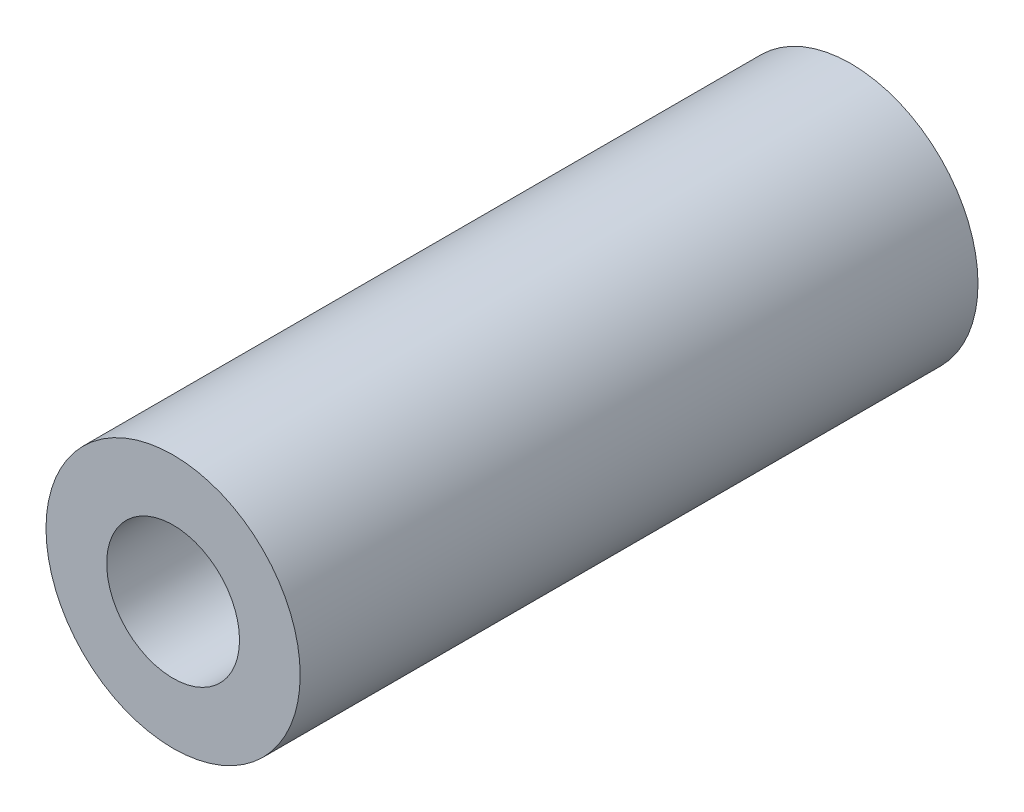
ISO-10303-21;
HEADER;
FILE_DESCRIPTION(('STEP AP214'),'2;1');
FILE_NAME('part.step','',(''),(''),'','','');
FILE_SCHEMA(('AUTOMOTIVE_DESIGN { 1 0 10303 214 1 1 1 1 }'));
ENDSEC;
DATA;
#1=APPLICATION_CONTEXT('core data for automotive mechanical design processes');
#2=APPLICATION_PROTOCOL_DEFINITION('international standard','automotive_design',2000,#1);
#3=PRODUCT_CONTEXT('',#1,'mechanical');
#4=PRODUCT('Part','Part','',(#3));
#5=PRODUCT_RELATED_PRODUCT_CATEGORY('part','',(#4));
#6=PRODUCT_DEFINITION_FORMATION('','',#4);
#7=PRODUCT_DEFINITION_CONTEXT('part definition',#1,'design');
#8=PRODUCT_DEFINITION('design','',#6,#7);
#9=PRODUCT_DEFINITION_SHAPE('','',#8);
#10=(LENGTH_UNIT() NAMED_UNIT(*) SI_UNIT(.MILLI.,.METRE.));
#11=(NAMED_UNIT(*) PLANE_ANGLE_UNIT() SI_UNIT($,.RADIAN.));
#12=(NAMED_UNIT(*) SI_UNIT($,.STERADIAN.) SOLID_ANGLE_UNIT());
#13=UNCERTAINTY_MEASURE_WITH_UNIT(LENGTH_MEASURE(1.E-05),#10,'distance_accuracy_value','');
#14=(GEOMETRIC_REPRESENTATION_CONTEXT(3) GLOBAL_UNCERTAINTY_ASSIGNED_CONTEXT((#13)) GLOBAL_UNIT_ASSIGNED_CONTEXT((#10,
#11,#12)) REPRESENTATION_CONTEXT('',''));
#15=CARTESIAN_POINT('',(0.,0.,0.));
#16=DIRECTION('',(0.,0.,1.));
#17=DIRECTION('',(1.,0.,0.));
#18=AXIS2_PLACEMENT_3D('',#15,#16,#17);
#19=CARTESIAN_POINT('',(0.,0.,25.4));
#20=DIRECTION('',(0.,0.,1.));
#21=DIRECTION('',(1.,0.,0.));
#22=AXIS2_PLACEMENT_3D('',#19,#20,#21);
#23=PLANE('',#22);
#24=CARTESIAN_POINT('',(0.,0.,25.4));
#25=DIRECTION('',(0.,0.,1.));
#26=DIRECTION('',(1.,0.,0.));
#27=AXIS2_PLACEMENT_3D('',#24,#25,#26);
#28=CIRCLE('',#27,4.7625);
#29=CARTESIAN_POINT('',(4.7625,0.,25.4));
#30=VERTEX_POINT('',#29);
#31=EDGE_CURVE('E10',#30,#30,#28,.T.);
#32=ORIENTED_EDGE('',*,*,#31,.T.);
#33=EDGE_LOOP('',(#32));
#34=FACE_BOUND('',#33,.T.);
#35=CARTESIAN_POINT('',(0.,0.,25.4));
#36=DIRECTION('',(0.,0.,1.));
#37=DIRECTION('',(1.,0.,0.));
#38=AXIS2_PLACEMENT_3D('',#35,#36,#37);
#39=CIRCLE('',#38,2.4892);
#40=CARTESIAN_POINT('',(2.4892,0.,25.4));
#41=VERTEX_POINT('',#40);
#42=EDGE_CURVE('E46',#41,#41,#39,.T.);
#43=ORIENTED_EDGE('',*,*,#42,.F.);
#44=EDGE_LOOP('',(#43));
#45=FACE_BOUND('',#44,.T.);
#46=ADVANCED_FACE('F35',(#34,#45),#23,.T.);
#47=CARTESIAN_POINT('',(0.,0.,0.));
#48=DIRECTION('',(0.,0.,1.));
#49=DIRECTION('',(1.,0.,0.));
#50=AXIS2_PLACEMENT_3D('',#47,#48,#49);
#51=PLANE('',#50);
#52=CARTESIAN_POINT('',(0.,0.,0.));
#53=DIRECTION('',(0.,0.,1.));
#54=DIRECTION('',(1.,0.,0.));
#55=AXIS2_PLACEMENT_3D('',#52,#53,#54);
#56=CIRCLE('',#55,4.7625);
#57=CARTESIAN_POINT('',(4.7625,0.,0.));
#58=VERTEX_POINT('',#57);
#59=EDGE_CURVE('E39',#58,#58,#56,.T.);
#60=ORIENTED_EDGE('',*,*,#59,.F.);
#61=EDGE_LOOP('',(#60));
#62=FACE_BOUND('',#61,.T.);
#63=CARTESIAN_POINT('',(0.,0.,0.));
#64=DIRECTION('',(0.,0.,1.));
#65=DIRECTION('',(1.,0.,0.));
#66=AXIS2_PLACEMENT_3D('',#63,#64,#65);
#67=CIRCLE('',#66,2.4892);
#68=CARTESIAN_POINT('',(2.4892,0.,0.));
#69=VERTEX_POINT('',#68);
#70=EDGE_CURVE('E48',#69,#69,#67,.T.);
#71=ORIENTED_EDGE('',*,*,#70,.T.);
#72=EDGE_LOOP('',(#71));
#73=FACE_BOUND('',#72,.T.);
#74=ADVANCED_FACE('F58',(#62,#73),#51,.F.);
#75=CARTESIAN_POINT('',(0.,0.,25.4));
#76=DIRECTION('',(0.,0.,-1.));
#77=DIRECTION('',(-1.,0.,0.));
#78=AXIS2_PLACEMENT_3D('',#75,#76,#77);
#79=CYLINDRICAL_SURFACE('',#78,4.7625);
#80=ORIENTED_EDGE('',*,*,#31,.F.);
#81=EDGE_LOOP('',(#80));
#82=FACE_BOUND('',#81,.T.);
#83=ORIENTED_EDGE('',*,*,#59,.T.);
#84=EDGE_LOOP('',(#83));
#85=FACE_BOUND('',#84,.T.);
#86=ADVANCED_FACE('F37',(#82,#85),#79,.T.);
#87=CARTESIAN_POINT('',(0.,0.,25.4));
#88=DIRECTION('',(0.,0.,-1.));
#89=DIRECTION('',(-1.,0.,0.));
#90=AXIS2_PLACEMENT_3D('',#87,#88,#89);
#91=CYLINDRICAL_SURFACE('',#90,2.4892);
#92=ORIENTED_EDGE('',*,*,#42,.T.);
#93=EDGE_LOOP('',(#92));
#94=FACE_BOUND('',#93,.T.);
#95=ORIENTED_EDGE('',*,*,#70,.F.);
#96=EDGE_LOOP('',(#95));
#97=FACE_BOUND('',#96,.T.);
#98=ADVANCED_FACE('F54',(#94,#97),#91,.F.);
#99=CLOSED_SHELL('',(#46,#74,#86,#98));
#100=MANIFOLD_SOLID_BREP('B2',#99);
#101=ADVANCED_BREP_SHAPE_REPRESENTATION('',(#18,#100),#14);
#102=SHAPE_DEFINITION_REPRESENTATION(#9,#101);
ENDSEC;
END-ISO-10303-21;
